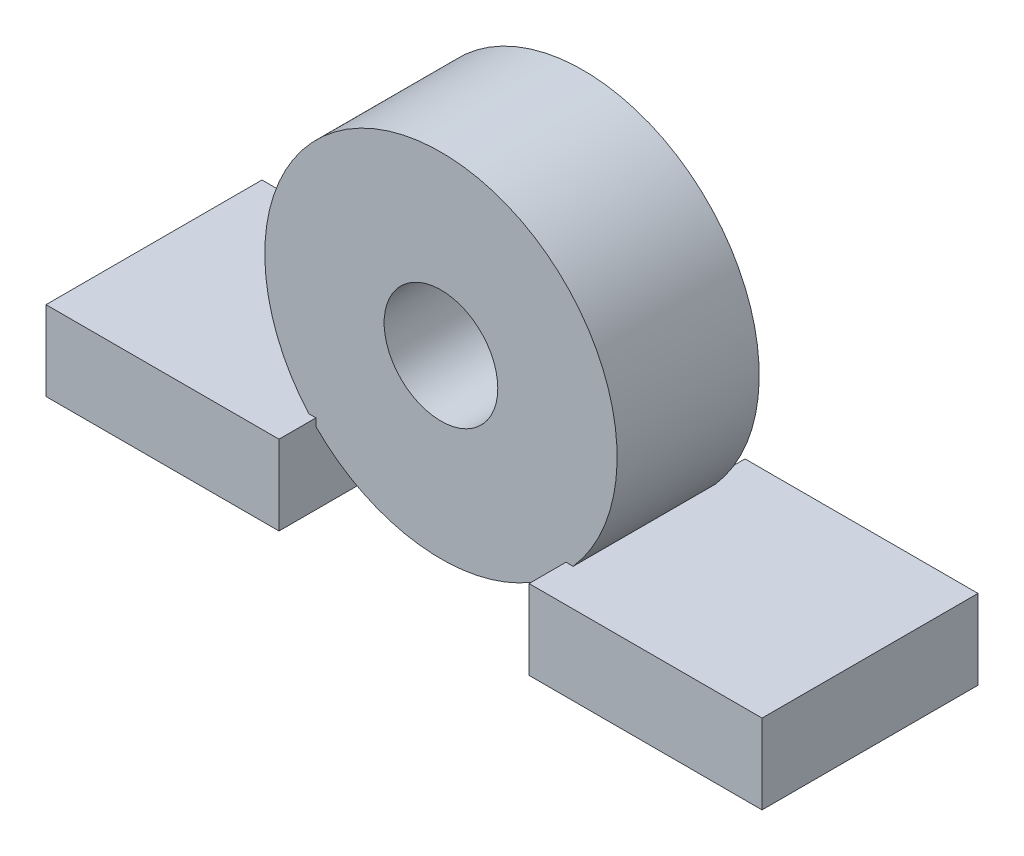
ISO-10303-21;
HEADER;
FILE_DESCRIPTION(('STEP AP214'),'2;1');
FILE_NAME('part.step','',(''),(''),'','','');
FILE_SCHEMA(('AUTOMOTIVE_DESIGN { 1 0 10303 214 1 1 1 1 }'));
ENDSEC;
DATA;
#1=APPLICATION_CONTEXT('core data for automotive mechanical design processes');
#2=APPLICATION_PROTOCOL_DEFINITION('international standard','automotive_design',2000,#1);
#3=PRODUCT_CONTEXT('',#1,'mechanical');
#4=PRODUCT('Part','Part','',(#3));
#5=PRODUCT_RELATED_PRODUCT_CATEGORY('part','',(#4));
#6=PRODUCT_DEFINITION_FORMATION('','',#4);
#7=PRODUCT_DEFINITION_CONTEXT('part definition',#1,'design');
#8=PRODUCT_DEFINITION('design','',#6,#7);
#9=PRODUCT_DEFINITION_SHAPE('','',#8);
#10=(LENGTH_UNIT() NAMED_UNIT(*) SI_UNIT(.MILLI.,.METRE.));
#11=(NAMED_UNIT(*) PLANE_ANGLE_UNIT() SI_UNIT($,.RADIAN.));
#12=(NAMED_UNIT(*) SI_UNIT($,.STERADIAN.) SOLID_ANGLE_UNIT());
#13=UNCERTAINTY_MEASURE_WITH_UNIT(LENGTH_MEASURE(1.E-05),#10,'distance_accuracy_value','');
#14=(GEOMETRIC_REPRESENTATION_CONTEXT(3) GLOBAL_UNCERTAINTY_ASSIGNED_CONTEXT((#13)) GLOBAL_UNIT_ASSIGNED_CONTEXT((#10,
#11,#12)) REPRESENTATION_CONTEXT('',''));
#15=CARTESIAN_POINT('',(0.,0.,0.));
#16=DIRECTION('',(0.,0.,1.));
#17=DIRECTION('',(1.,0.,0.));
#18=AXIS2_PLACEMENT_3D('',#15,#16,#17);
#19=CARTESIAN_POINT('',(50.,-1.5,30.));
#20=DIRECTION('',(0.,0.,1.));
#21=DIRECTION('',(1.,0.,0.));
#22=AXIS2_PLACEMENT_3D('',#19,#20,#21);
#23=PLANE('',#22);
#24=CARTESIAN_POINT('',(50.,-1.5,30.));
#25=DIRECTION('',(0.,0.,1.));
#26=DIRECTION('',(1.,0.,0.));
#27=AXIS2_PLACEMENT_3D('',#24,#25,#26);
#28=CIRCLE('',#27,10.);
#29=CARTESIAN_POINT('',(60.,-1.5,30.));
#30=VERTEX_POINT('',#29);
#31=EDGE_CURVE('E172',#30,#30,#28,.T.);
#32=ORIENTED_EDGE('',*,*,#31,.F.);
#33=EDGE_LOOP('',(#32));
#34=FACE_BOUND('',#33,.T.);
#35=CARTESIAN_POINT('',(50.,-1.5,30.));
#36=DIRECTION('',(0.,0.,1.));
#37=DIRECTION('',(1.,0.,0.));
#38=AXIS2_PLACEMENT_3D('',#35,#36,#37);
#39=CIRCLE('',#38,31.);
#40=CARTESIAN_POINT('',(28.,-23.3403296678416,30.));
#41=VERTEX_POINT('',#40);
#42=CARTESIAN_POINT('',(72.,-23.3403296678416,30.));
#43=VERTEX_POINT('',#42);
#44=EDGE_CURVE('E178',#41,#43,#39,.T.);
#45=ORIENTED_EDGE('',*,*,#44,.T.);
#46=DIRECTION('',(0.,1.,0.));
#47=VECTOR('',#46,1.);
#48=CARTESIAN_POINT('',(72.,-1.5,30.));
#49=LINE('',#48,#47);
#50=CARTESIAN_POINT('',(72.,-22.,30.));
#51=VERTEX_POINT('',#50);
#52=EDGE_CURVE('E169',#43,#51,#49,.T.);
#53=ORIENTED_EDGE('',*,*,#52,.T.);
#54=DIRECTION('',(-1.,0.,0.));
#55=VECTOR('',#54,1.);
#56=CARTESIAN_POINT('',(50.,-22.,30.));
#57=LINE('',#56,#55);
#58=CARTESIAN_POINT('',(73.254031908467,-22.,30.));
#59=VERTEX_POINT('',#58);
#60=EDGE_CURVE('E139',#59,#51,#57,.T.);
#61=ORIENTED_EDGE('',*,*,#60,.F.);
#62=CARTESIAN_POINT('',(26.745968091533,-22.,30.));
#63=VERTEX_POINT('',#62);
#64=EDGE_CURVE('E182',#59,#63,#39,.T.);
#65=ORIENTED_EDGE('',*,*,#64,.T.);
#66=DIRECTION('',(-1.,0.,0.));
#67=VECTOR('',#66,1.);
#68=CARTESIAN_POINT('',(0.,-22.,30.));
#69=LINE('',#68,#67);
#70=CARTESIAN_POINT('',(28.,-22.,30.));
#71=VERTEX_POINT('',#70);
#72=EDGE_CURVE('E227',#71,#63,#69,.T.);
#73=ORIENTED_EDGE('',*,*,#72,.F.);
#74=DIRECTION('',(0.,1.,0.));
#75=VECTOR('',#74,1.);
#76=CARTESIAN_POINT('',(28.,-22.,30.));
#77=LINE('',#76,#75);
#78=EDGE_CURVE('E188',#41,#71,#77,.T.);
#79=ORIENTED_EDGE('',*,*,#78,.F.);
#80=EDGE_LOOP('',(#45,#53,#61,#65,#73,#79));
#81=FACE_BOUND('',#80,.T.);
#82=ADVANCED_FACE('F33',(#34,#81),#23,.T.);
#83=CARTESIAN_POINT('',(50.,-1.5,5.));
#84=DIRECTION('',(0.,0.,1.));
#85=DIRECTION('',(1.,0.,0.));
#86=AXIS2_PLACEMENT_3D('',#83,#84,#85);
#87=PLANE('',#86);
#88=CARTESIAN_POINT('',(50.,-1.5,5.));
#89=DIRECTION('',(0.,0.,1.));
#90=DIRECTION('',(1.,0.,0.));
#91=AXIS2_PLACEMENT_3D('',#88,#89,#90);
#92=CIRCLE('',#91,10.);
#93=CARTESIAN_POINT('',(60.,-1.5,5.));
#94=VERTEX_POINT('',#93);
#95=EDGE_CURVE('E171',#94,#94,#92,.T.);
#96=ORIENTED_EDGE('',*,*,#95,.T.);
#97=EDGE_LOOP('',(#96));
#98=FACE_BOUND('',#97,.T.);
#99=DIRECTION('',(0.,1.,0.));
#100=VECTOR('',#99,1.);
#101=CARTESIAN_POINT('',(72.,-1.5,5.));
#102=LINE('',#101,#100);
#103=CARTESIAN_POINT('',(72.,-23.3403296678416,5.));
#104=VERTEX_POINT('',#103);
#105=CARTESIAN_POINT('',(72.,-22.,5.));
#106=VERTEX_POINT('',#105);
#107=EDGE_CURVE('E167',#104,#106,#102,.T.);
#108=ORIENTED_EDGE('',*,*,#107,.F.);
#109=CARTESIAN_POINT('',(50.,-1.5,5.));
#110=DIRECTION('',(0.,0.,1.));
#111=DIRECTION('',(1.,0.,0.));
#112=AXIS2_PLACEMENT_3D('',#109,#110,#111);
#113=CIRCLE('',#112,31.);
#114=CARTESIAN_POINT('',(28.,-23.3403296678416,5.));
#115=VERTEX_POINT('',#114);
#116=EDGE_CURVE('E183',#115,#104,#113,.T.);
#117=ORIENTED_EDGE('',*,*,#116,.F.);
#118=DIRECTION('',(0.,1.,0.));
#119=VECTOR('',#118,1.);
#120=CARTESIAN_POINT('',(28.,-22.,5.));
#121=LINE('',#120,#119);
#122=CARTESIAN_POINT('',(28.,-22.,5.));
#123=VERTEX_POINT('',#122);
#124=EDGE_CURVE('E56',#115,#123,#121,.T.);
#125=ORIENTED_EDGE('',*,*,#124,.T.);
#126=DIRECTION('',(-1.,0.,0.));
#127=VECTOR('',#126,1.);
#128=CARTESIAN_POINT('',(0.,-22.,5.));
#129=LINE('',#128,#127);
#130=CARTESIAN_POINT('',(26.745968091533,-22.,5.));
#131=VERTEX_POINT('',#130);
#132=EDGE_CURVE('E224',#123,#131,#129,.T.);
#133=ORIENTED_EDGE('',*,*,#132,.T.);
#134=CARTESIAN_POINT('',(73.254031908467,-22.,5.));
#135=VERTEX_POINT('',#134);
#136=EDGE_CURVE('E175',#135,#131,#113,.T.);
#137=ORIENTED_EDGE('',*,*,#136,.F.);
#138=DIRECTION('',(-1.,0.,0.));
#139=VECTOR('',#138,1.);
#140=CARTESIAN_POINT('',(50.,-22.,5.));
#141=LINE('',#140,#139);
#142=EDGE_CURVE('E48',#135,#106,#141,.T.);
#143=ORIENTED_EDGE('',*,*,#142,.T.);
#144=EDGE_LOOP('',(#108,#117,#125,#133,#137,#143));
#145=FACE_BOUND('',#144,.T.);
#146=ADVANCED_FACE('F236',(#98,#145),#87,.F.);
#147=CARTESIAN_POINT('',(50.,-1.5,30.));
#148=DIRECTION('',(0.,0.,-1.));
#149=DIRECTION('',(-1.,0.,0.));
#150=AXIS2_PLACEMENT_3D('',#147,#148,#149);
#151=CYLINDRICAL_SURFACE('',#150,31.);
#152=DIRECTION('',(0.,0.,-1.));
#153=VECTOR('',#152,1.);
#154=CARTESIAN_POINT('',(72.,-23.3403296678416,30.));
#155=LINE('',#154,#153);
#156=EDGE_CURVE('E11',#43,#104,#155,.T.);
#157=ORIENTED_EDGE('',*,*,#156,.F.);
#158=ORIENTED_EDGE('',*,*,#44,.F.);
#159=DIRECTION('',(0.,0.,-1.));
#160=VECTOR('',#159,1.);
#161=CARTESIAN_POINT('',(28.,-23.3403296678416,30.));
#162=LINE('',#161,#160);
#163=EDGE_CURVE('E181',#41,#115,#162,.T.);
#164=ORIENTED_EDGE('',*,*,#163,.T.);
#165=ORIENTED_EDGE('',*,*,#116,.T.);
#166=EDGE_LOOP('',(#157,#158,#164,#165));
#167=FACE_BOUND('',#166,.T.);
#168=ADVANCED_FACE('F263',(#167),#151,.T.);
#169=CARTESIAN_POINT('',(28.,-22.,-1.5));
#170=DIRECTION('',(-1.,0.,0.));
#171=DIRECTION('',(0.,0.,1.));
#172=AXIS2_PLACEMENT_3D('',#169,#170,#171);
#173=PLANE('',#172);
#174=ORIENTED_EDGE('',*,*,#163,.F.);
#175=ORIENTED_EDGE('',*,*,#78,.T.);
#176=DIRECTION('',(0.,0.,-1.));
#177=VECTOR('',#176,1.);
#178=CARTESIAN_POINT('',(28.,-22.,-1.5));
#179=LINE('',#178,#177);
#180=CARTESIAN_POINT('',(28.,-22.,36.5));
#181=VERTEX_POINT('',#180);
#182=EDGE_CURVE('E191',#181,#71,#179,.T.);
#183=ORIENTED_EDGE('',*,*,#182,.F.);
#184=DIRECTION('',(0.,-1.,0.));
#185=VECTOR('',#184,1.);
#186=CARTESIAN_POINT('',(28.,-22.,36.5));
#187=LINE('',#186,#185);
#188=CARTESIAN_POINT('',(28.,-36.,36.5));
#189=VERTEX_POINT('',#188);
#190=EDGE_CURVE('E201',#181,#189,#187,.T.);
#191=ORIENTED_EDGE('',*,*,#190,.T.);
#192=DIRECTION('',(0.,0.,-1.));
#193=VECTOR('',#192,1.);
#194=CARTESIAN_POINT('',(28.,-36.,-1.5));
#195=LINE('',#194,#193);
#196=CARTESIAN_POINT('',(28.,-36.,-1.5));
#197=VERTEX_POINT('',#196);
#198=EDGE_CURVE('E190',#189,#197,#195,.T.);
#199=ORIENTED_EDGE('',*,*,#198,.T.);
#200=DIRECTION('',(0.,-1.,0.));
#201=VECTOR('',#200,1.);
#202=CARTESIAN_POINT('',(28.,-22.,-1.5));
#203=LINE('',#202,#201);
#204=CARTESIAN_POINT('',(28.,-22.,-1.5));
#205=VERTEX_POINT('',#204);
#206=EDGE_CURVE('E218',#205,#197,#203,.T.);
#207=ORIENTED_EDGE('',*,*,#206,.F.);
#208=EDGE_CURVE('E195',#123,#205,#179,.T.);
#209=ORIENTED_EDGE('',*,*,#208,.F.);
#210=ORIENTED_EDGE('',*,*,#124,.F.);
#211=EDGE_LOOP('',(#174,#175,#183,#191,#199,#207,#209,#210));
#212=FACE_BOUND('',#211,.T.);
#213=ADVANCED_FACE('F35',(#212),#173,.F.);
#214=CARTESIAN_POINT('',(28.,-22.,-1.5));
#215=DIRECTION('',(0.,0.,1.));
#216=DIRECTION('',(1.,0.,0.));
#217=AXIS2_PLACEMENT_3D('',#214,#215,#216);
#218=PLANE('',#217);
#219=DIRECTION('',(-1.,0.,0.));
#220=VECTOR('',#219,1.);
#221=CARTESIAN_POINT('',(28.,-36.,-1.5));
#222=LINE('',#221,#220);
#223=CARTESIAN_POINT('',(-13.0000000000001,-36.,-1.5));
#224=VERTEX_POINT('',#223);
#225=EDGE_CURVE('E204',#197,#224,#222,.T.);
#226=ORIENTED_EDGE('',*,*,#225,.T.);
#227=DIRECTION('',(0.,-1.,0.));
#228=VECTOR('',#227,1.);
#229=CARTESIAN_POINT('',(-13.0000000000001,-22.,-1.5));
#230=LINE('',#229,#228);
#231=CARTESIAN_POINT('',(-13.0000000000001,-22.,-1.5));
#232=VERTEX_POINT('',#231);
#233=EDGE_CURVE('E215',#232,#224,#230,.T.);
#234=ORIENTED_EDGE('',*,*,#233,.F.);
#235=DIRECTION('',(-1.,0.,0.));
#236=VECTOR('',#235,1.);
#237=CARTESIAN_POINT('',(28.,-22.,-1.5));
#238=LINE('',#237,#236);
#239=EDGE_CURVE('E194',#205,#232,#238,.T.);
#240=ORIENTED_EDGE('',*,*,#239,.F.);
#241=ORIENTED_EDGE('',*,*,#206,.T.);
#242=EDGE_LOOP('',(#226,#234,#240,#241));
#243=FACE_BOUND('',#242,.T.);
#244=ADVANCED_FACE('F244',(#243),#218,.F.);
#245=CARTESIAN_POINT('',(-13.0000000000001,-22.,-1.5));
#246=DIRECTION('',(1.,0.,0.));
#247=DIRECTION('',(0.,0.,-1.));
#248=AXIS2_PLACEMENT_3D('',#245,#246,#247);
#249=PLANE('',#248);
#250=DIRECTION('',(0.,0.,1.));
#251=VECTOR('',#250,1.);
#252=CARTESIAN_POINT('',(-13.0000000000001,-36.,-1.5));
#253=LINE('',#252,#251);
#254=CARTESIAN_POINT('',(-13.0000000000001,-36.,36.5));
#255=VERTEX_POINT('',#254);
#256=EDGE_CURVE('E206',#224,#255,#253,.T.);
#257=ORIENTED_EDGE('',*,*,#256,.T.);
#258=DIRECTION('',(0.,-1.,0.));
#259=VECTOR('',#258,1.);
#260=CARTESIAN_POINT('',(-13.0000000000001,-22.,36.5));
#261=LINE('',#260,#259);
#262=CARTESIAN_POINT('',(-13.0000000000001,-22.,36.5));
#263=VERTEX_POINT('',#262);
#264=EDGE_CURVE('E212',#263,#255,#261,.T.);
#265=ORIENTED_EDGE('',*,*,#264,.F.);
#266=DIRECTION('',(0.,0.,1.));
#267=VECTOR('',#266,1.);
#268=CARTESIAN_POINT('',(-13.0000000000001,-22.,-1.5));
#269=LINE('',#268,#267);
#270=EDGE_CURVE('E197',#232,#263,#269,.T.);
#271=ORIENTED_EDGE('',*,*,#270,.F.);
#272=ORIENTED_EDGE('',*,*,#233,.T.);
#273=EDGE_LOOP('',(#257,#265,#271,#272));
#274=FACE_BOUND('',#273,.T.);
#275=ADVANCED_FACE('F251',(#274),#249,.F.);
#276=CARTESIAN_POINT('',(28.,-22.,36.5));
#277=DIRECTION('',(0.,0.,-1.));
#278=DIRECTION('',(-1.,0.,0.));
#279=AXIS2_PLACEMENT_3D('',#276,#277,#278);
#280=PLANE('',#279);
#281=DIRECTION('',(1.,0.,0.));
#282=VECTOR('',#281,1.);
#283=CARTESIAN_POINT('',(28.,-36.,36.5));
#284=LINE('',#283,#282);
#285=EDGE_CURVE('E208',#255,#189,#284,.T.);
#286=ORIENTED_EDGE('',*,*,#285,.T.);
#287=ORIENTED_EDGE('',*,*,#190,.F.);
#288=DIRECTION('',(1.,0.,0.));
#289=VECTOR('',#288,1.);
#290=CARTESIAN_POINT('',(28.,-22.,36.5));
#291=LINE('',#290,#289);
#292=EDGE_CURVE('E199',#263,#181,#291,.T.);
#293=ORIENTED_EDGE('',*,*,#292,.F.);
#294=ORIENTED_EDGE('',*,*,#264,.T.);
#295=EDGE_LOOP('',(#286,#287,#293,#294));
#296=FACE_BOUND('',#295,.T.);
#297=ADVANCED_FACE('F255',(#296),#280,.F.);
#298=CARTESIAN_POINT('',(0.,-22.,0.));
#299=DIRECTION('',(0.,-1.,0.));
#300=DIRECTION('',(0.,0.,-1.));
#301=AXIS2_PLACEMENT_3D('',#298,#299,#300);
#302=PLANE('',#301);
#303=ORIENTED_EDGE('',*,*,#182,.T.);
#304=ORIENTED_EDGE('',*,*,#72,.T.);
#305=DIRECTION('',(0.,0.,-1.));
#306=VECTOR('',#305,1.);
#307=CARTESIAN_POINT('',(26.745968091533,-22.,30.));
#308=LINE('',#307,#306);
#309=EDGE_CURVE('E221',#131,#63,#308,.F.);
#310=ORIENTED_EDGE('',*,*,#309,.F.);
#311=ORIENTED_EDGE('',*,*,#132,.F.);
#312=ORIENTED_EDGE('',*,*,#208,.T.);
#313=ORIENTED_EDGE('',*,*,#239,.T.);
#314=ORIENTED_EDGE('',*,*,#270,.T.);
#315=ORIENTED_EDGE('',*,*,#292,.T.);
#316=EDGE_LOOP('',(#303,#304,#310,#311,#312,#313,#314,#315));
#317=FACE_BOUND('',#316,.T.);
#318=ADVANCED_FACE('F239',(#317),#302,.F.);
#319=CARTESIAN_POINT('',(0.,-36.,0.));
#320=DIRECTION('',(0.,-1.,0.));
#321=DIRECTION('',(0.,0.,-1.));
#322=AXIS2_PLACEMENT_3D('',#319,#320,#321);
#323=PLANE('',#322);
#324=ORIENTED_EDGE('',*,*,#198,.F.);
#325=ORIENTED_EDGE('',*,*,#285,.F.);
#326=ORIENTED_EDGE('',*,*,#256,.F.);
#327=ORIENTED_EDGE('',*,*,#225,.F.);
#328=EDGE_LOOP('',(#324,#325,#326,#327));
#329=FACE_BOUND('',#328,.T.);
#330=ADVANCED_FACE('F311',(#329),#323,.T.);
#331=ORIENTED_EDGE('',*,*,#64,.F.);
#332=DIRECTION('',(0.,0.,-1.));
#333=VECTOR('',#332,1.);
#334=CARTESIAN_POINT('',(73.254031908467,-22.,30.));
#335=LINE('',#334,#333);
#336=EDGE_CURVE('E41',#59,#135,#335,.T.);
#337=ORIENTED_EDGE('',*,*,#336,.T.);
#338=ORIENTED_EDGE('',*,*,#136,.T.);
#339=ORIENTED_EDGE('',*,*,#309,.T.);
#340=EDGE_LOOP('',(#331,#337,#338,#339));
#341=FACE_BOUND('',#340,.T.);
#342=ADVANCED_FACE('F232',(#341),#151,.T.);
#343=CARTESIAN_POINT('',(50.,-1.5,30.));
#344=DIRECTION('',(0.,0.,-1.));
#345=DIRECTION('',(-1.,0.,0.));
#346=AXIS2_PLACEMENT_3D('',#343,#344,#345);
#347=CYLINDRICAL_SURFACE('',#346,10.);
#348=ORIENTED_EDGE('',*,*,#31,.T.);
#349=EDGE_LOOP('',(#348));
#350=FACE_BOUND('',#349,.T.);
#351=ORIENTED_EDGE('',*,*,#95,.F.);
#352=EDGE_LOOP('',(#351));
#353=FACE_BOUND('',#352,.T.);
#354=ADVANCED_FACE('F306',(#350,#353),#347,.F.);
#355=CARTESIAN_POINT('',(72.,-22.,-1.5));
#356=DIRECTION('',(1.,0.,0.));
#357=DIRECTION('',(0.,0.,-1.));
#358=AXIS2_PLACEMENT_3D('',#355,#356,#357);
#359=PLANE('',#358);
#360=ORIENTED_EDGE('',*,*,#52,.F.);
#361=ORIENTED_EDGE('',*,*,#156,.T.);
#362=ORIENTED_EDGE('',*,*,#107,.T.);
#363=DIRECTION('',(0.,0.,1.));
#364=VECTOR('',#363,1.);
#365=CARTESIAN_POINT('',(72.,-22.,-1.5));
#366=LINE('',#365,#364);
#367=CARTESIAN_POINT('',(72.,-22.,-1.5));
#368=VERTEX_POINT('',#367);
#369=EDGE_CURVE('E143',#368,#106,#366,.T.);
#370=ORIENTED_EDGE('',*,*,#369,.F.);
#371=DIRECTION('',(0.,-1.,0.));
#372=VECTOR('',#371,1.);
#373=CARTESIAN_POINT('',(72.,-22.,-1.5));
#374=LINE('',#373,#372);
#375=CARTESIAN_POINT('',(72.,-36.,-1.5));
#376=VERTEX_POINT('',#375);
#377=EDGE_CURVE('E271',#368,#376,#374,.T.);
#378=ORIENTED_EDGE('',*,*,#377,.T.);
#379=DIRECTION('',(0.,0.,1.));
#380=VECTOR('',#379,1.);
#381=CARTESIAN_POINT('',(72.,-36.,-1.5));
#382=LINE('',#381,#380);
#383=CARTESIAN_POINT('',(72.,-36.,36.5));
#384=VERTEX_POINT('',#383);
#385=EDGE_CURVE('E159',#376,#384,#382,.T.);
#386=ORIENTED_EDGE('',*,*,#385,.T.);
#387=DIRECTION('',(0.,-1.,0.));
#388=VECTOR('',#387,1.);
#389=CARTESIAN_POINT('',(72.,-22.,36.5));
#390=LINE('',#389,#388);
#391=CARTESIAN_POINT('',(72.,-22.,36.5));
#392=VERTEX_POINT('',#391);
#393=EDGE_CURVE('E149',#392,#384,#390,.T.);
#394=ORIENTED_EDGE('',*,*,#393,.F.);
#395=EDGE_CURVE('E133',#51,#392,#366,.T.);
#396=ORIENTED_EDGE('',*,*,#395,.F.);
#397=EDGE_LOOP('',(#360,#361,#362,#370,#378,#386,#394,#396));
#398=FACE_BOUND('',#397,.T.);
#399=ADVANCED_FACE('F156',(#398),#359,.F.);
#400=CARTESIAN_POINT('',(72.,-22.,36.5));
#401=DIRECTION('',(0.,0.,-1.));
#402=DIRECTION('',(-1.,0.,0.));
#403=AXIS2_PLACEMENT_3D('',#400,#401,#402);
#404=PLANE('',#403);
#405=DIRECTION('',(1.,0.,0.));
#406=VECTOR('',#405,1.);
#407=CARTESIAN_POINT('',(72.,-36.,36.5));
#408=LINE('',#407,#406);
#409=CARTESIAN_POINT('',(113.,-36.,36.5));
#410=VERTEX_POINT('',#409);
#411=EDGE_CURVE('E273',#384,#410,#408,.T.);
#412=ORIENTED_EDGE('',*,*,#411,.T.);
#413=DIRECTION('',(0.,-1.,0.));
#414=VECTOR('',#413,1.);
#415=CARTESIAN_POINT('',(113.,-22.,36.5));
#416=LINE('',#415,#414);
#417=CARTESIAN_POINT('',(113.,-22.,36.5));
#418=VERTEX_POINT('',#417);
#419=EDGE_CURVE('E152',#418,#410,#416,.T.);
#420=ORIENTED_EDGE('',*,*,#419,.F.);
#421=DIRECTION('',(1.,0.,0.));
#422=VECTOR('',#421,1.);
#423=CARTESIAN_POINT('',(72.,-22.,36.5));
#424=LINE('',#423,#422);
#425=EDGE_CURVE('E136',#392,#418,#424,.T.);
#426=ORIENTED_EDGE('',*,*,#425,.F.);
#427=ORIENTED_EDGE('',*,*,#393,.T.);
#428=EDGE_LOOP('',(#412,#420,#426,#427));
#429=FACE_BOUND('',#428,.T.);
#430=ADVANCED_FACE('F148',(#429),#404,.F.);
#431=CARTESIAN_POINT('',(113.,-22.,-1.5));
#432=DIRECTION('',(-1.,0.,0.));
#433=DIRECTION('',(0.,0.,1.));
#434=AXIS2_PLACEMENT_3D('',#431,#432,#433);
#435=PLANE('',#434);
#436=DIRECTION('',(0.,0.,-1.));
#437=VECTOR('',#436,1.);
#438=CARTESIAN_POINT('',(113.,-36.,-1.5));
#439=LINE('',#438,#437);
#440=CARTESIAN_POINT('',(113.,-36.,-1.5));
#441=VERTEX_POINT('',#440);
#442=EDGE_CURVE('E275',#410,#441,#439,.T.);
#443=ORIENTED_EDGE('',*,*,#442,.T.);
#444=DIRECTION('',(0.,-1.,0.));
#445=VECTOR('',#444,1.);
#446=CARTESIAN_POINT('',(113.,-22.,-1.5));
#447=LINE('',#446,#445);
#448=CARTESIAN_POINT('',(113.,-22.,-1.5));
#449=VERTEX_POINT('',#448);
#450=EDGE_CURVE('E162',#449,#441,#447,.T.);
#451=ORIENTED_EDGE('',*,*,#450,.F.);
#452=DIRECTION('',(0.,0.,-1.));
#453=VECTOR('',#452,1.);
#454=CARTESIAN_POINT('',(113.,-22.,-1.5));
#455=LINE('',#454,#453);
#456=EDGE_CURVE('E154',#418,#449,#455,.T.);
#457=ORIENTED_EDGE('',*,*,#456,.F.);
#458=ORIENTED_EDGE('',*,*,#419,.T.);
#459=EDGE_LOOP('',(#443,#451,#457,#458));
#460=FACE_BOUND('',#459,.T.);
#461=ADVANCED_FACE('F287',(#460),#435,.F.);
#462=CARTESIAN_POINT('',(72.,-22.,-1.5));
#463=DIRECTION('',(0.,0.,1.));
#464=DIRECTION('',(1.,0.,0.));
#465=AXIS2_PLACEMENT_3D('',#462,#463,#464);
#466=PLANE('',#465);
#467=DIRECTION('',(-1.,0.,0.));
#468=VECTOR('',#467,1.);
#469=CARTESIAN_POINT('',(72.,-36.,-1.5));
#470=LINE('',#469,#468);
#471=EDGE_CURVE('E144',#441,#376,#470,.T.);
#472=ORIENTED_EDGE('',*,*,#471,.T.);
#473=ORIENTED_EDGE('',*,*,#377,.F.);
#474=DIRECTION('',(-1.,0.,0.));
#475=VECTOR('',#474,1.);
#476=CARTESIAN_POINT('',(72.,-22.,-1.5));
#477=LINE('',#476,#475);
#478=EDGE_CURVE('E266',#449,#368,#477,.T.);
#479=ORIENTED_EDGE('',*,*,#478,.F.);
#480=ORIENTED_EDGE('',*,*,#450,.T.);
#481=EDGE_LOOP('',(#472,#473,#479,#480));
#482=FACE_BOUND('',#481,.T.);
#483=ADVANCED_FACE('F282',(#482),#466,.F.);
#484=CARTESIAN_POINT('',(0.,-22.,0.));
#485=DIRECTION('',(0.,1.,0.));
#486=DIRECTION('',(0.,0.,1.));
#487=AXIS2_PLACEMENT_3D('',#484,#485,#486);
#488=PLANE('',#487);
#489=ORIENTED_EDGE('',*,*,#336,.F.);
#490=ORIENTED_EDGE('',*,*,#60,.T.);
#491=ORIENTED_EDGE('',*,*,#395,.T.);
#492=ORIENTED_EDGE('',*,*,#425,.T.);
#493=ORIENTED_EDGE('',*,*,#456,.T.);
#494=ORIENTED_EDGE('',*,*,#478,.T.);
#495=ORIENTED_EDGE('',*,*,#369,.T.);
#496=ORIENTED_EDGE('',*,*,#142,.F.);
#497=EDGE_LOOP('',(#489,#490,#491,#492,#493,#494,#495,#496));
#498=FACE_BOUND('',#497,.T.);
#499=ADVANCED_FACE('F135',(#498),#488,.T.);
#500=CARTESIAN_POINT('',(0.,-36.,0.));
#501=DIRECTION('',(0.,1.,0.));
#502=DIRECTION('',(0.,0.,1.));
#503=AXIS2_PLACEMENT_3D('',#500,#501,#502);
#504=PLANE('',#503);
#505=ORIENTED_EDGE('',*,*,#385,.F.);
#506=ORIENTED_EDGE('',*,*,#471,.F.);
#507=ORIENTED_EDGE('',*,*,#442,.F.);
#508=ORIENTED_EDGE('',*,*,#411,.F.);
#509=EDGE_LOOP('',(#505,#506,#507,#508));
#510=FACE_BOUND('',#509,.T.);
#511=ADVANCED_FACE('F286',(#510),#504,.F.);
#512=CLOSED_SHELL('',(#82,#146,#168,#213,#244,#275,#297,#318,#330,#342,#354,#399,#430,#461,#483,
#499,#511));
#513=MANIFOLD_SOLID_BREP('B2',#512);
#514=ADVANCED_BREP_SHAPE_REPRESENTATION('',(#18,#513),#14);
#515=SHAPE_DEFINITION_REPRESENTATION(#9,#514);
ENDSEC;
END-ISO-10303-21;
